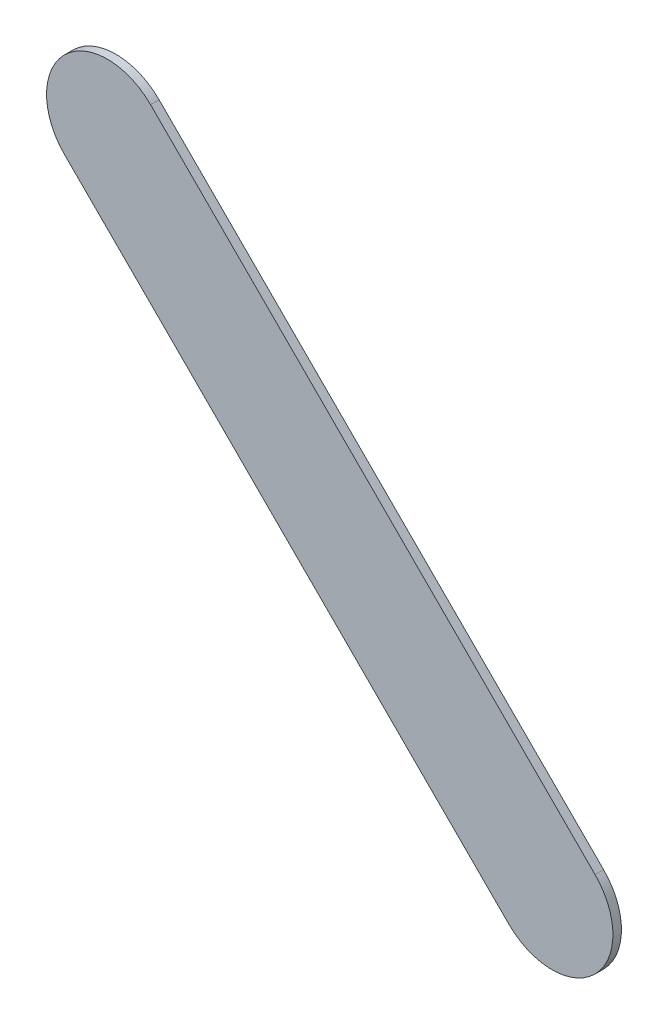
ISO-10303-21;
HEADER;
FILE_DESCRIPTION(('STEP AP214'),'2;1');
FILE_NAME('part.step','',(''),(''),'','','');
FILE_SCHEMA(('AUTOMOTIVE_DESIGN { 1 0 10303 214 1 1 1 1 }'));
ENDSEC;
DATA;
#1=APPLICATION_CONTEXT('core data for automotive mechanical design processes');
#2=APPLICATION_PROTOCOL_DEFINITION('international standard','automotive_design',2000,#1);
#3=PRODUCT_CONTEXT('',#1,'mechanical');
#4=PRODUCT('Part','Part','',(#3));
#5=PRODUCT_RELATED_PRODUCT_CATEGORY('part','',(#4));
#6=PRODUCT_DEFINITION_FORMATION('','',#4);
#7=PRODUCT_DEFINITION_CONTEXT('part definition',#1,'design');
#8=PRODUCT_DEFINITION('design','',#6,#7);
#9=PRODUCT_DEFINITION_SHAPE('','',#8);
#10=(LENGTH_UNIT() NAMED_UNIT(*) SI_UNIT(.MILLI.,.METRE.));
#11=(NAMED_UNIT(*) PLANE_ANGLE_UNIT() SI_UNIT($,.RADIAN.));
#12=(NAMED_UNIT(*) SI_UNIT($,.STERADIAN.) SOLID_ANGLE_UNIT());
#13=UNCERTAINTY_MEASURE_WITH_UNIT(LENGTH_MEASURE(1.E-05),#10,'distance_accuracy_value','');
#14=(GEOMETRIC_REPRESENTATION_CONTEXT(3) GLOBAL_UNCERTAINTY_ASSIGNED_CONTEXT((#13)) GLOBAL_UNIT_ASSIGNED_CONTEXT((#10,
#11,#12)) REPRESENTATION_CONTEXT('',''));
#15=CARTESIAN_POINT('',(0.,0.,0.));
#16=DIRECTION('',(0.,0.,1.));
#17=DIRECTION('',(1.,0.,0.));
#18=AXIS2_PLACEMENT_3D('',#15,#16,#17);
#19=CARTESIAN_POINT('',(82.123223,-120.976776,1.635));
#20=DIRECTION('',(0.,0.,1.));
#21=DIRECTION('',(1.,0.,0.));
#22=AXIS2_PLACEMENT_3D('',#19,#20,#21);
#23=PLANE('',#22);
#24=DIRECTION('',(0.707106781186548,-0.707106781186548,0.));
#25=VECTOR('',#24,1.);
#26=CARTESIAN_POINT('',(82.123223,-120.976776,1.635));
#27=LINE('',#26,#25);
#28=CARTESIAN_POINT('',(82.123223,-120.976776,1.635));
#29=VERTEX_POINT('',#28);
#30=CARTESIAN_POINT('',(83.948223,-122.801776,1.635));
#31=VERTEX_POINT('',#30);
#32=EDGE_CURVE('E91',#29,#31,#27,.T.);
#33=ORIENTED_EDGE('',*,*,#32,.T.);
#34=CARTESIAN_POINT('',(84.1249995,-122.6249995,1.635));
#35=DIRECTION('',(0.,0.,1.));
#36=DIRECTION('',(-0.707106781186548,-0.707106781186548,0.));
#37=AXIS2_PLACEMENT_3D('',#34,#35,#36);
#38=CIRCLE('',#37,0.249999723809);
#39=CARTESIAN_POINT('',(84.301776,-122.448223,1.635));
#40=VERTEX_POINT('',#39);
#41=EDGE_CURVE('E80',#31,#40,#38,.T.);
#42=ORIENTED_EDGE('',*,*,#41,.T.);
#43=DIRECTION('',(-0.707106781186548,0.707106781186548,0.));
#44=VECTOR('',#43,1.);
#45=CARTESIAN_POINT('',(84.301776,-122.448223,1.635));
#46=LINE('',#45,#44);
#47=CARTESIAN_POINT('',(82.476776,-120.623223,1.635));
#48=VERTEX_POINT('',#47);
#49=EDGE_CURVE('E20',#40,#48,#46,.T.);
#50=ORIENTED_EDGE('',*,*,#49,.T.);
#51=CARTESIAN_POINT('',(82.2999995,-120.7999995,1.635));
#52=DIRECTION('',(0.,0.,1.));
#53=DIRECTION('',(0.707106781186548,0.707106781186548,0.));
#54=AXIS2_PLACEMENT_3D('',#51,#52,#53);
#55=CIRCLE('',#54,0.249999723809);
#56=EDGE_CURVE('E11',#48,#29,#55,.T.);
#57=ORIENTED_EDGE('',*,*,#56,.T.);
#58=EDGE_LOOP('',(#33,#42,#50,#57));
#59=FACE_BOUND('',#58,.T.);
#60=ADVANCED_FACE('F17',(#59),#23,.T.);
#61=CARTESIAN_POINT('',(82.123223,-120.976776,1.6));
#62=DIRECTION('',(0.,0.,1.));
#63=DIRECTION('',(1.,0.,0.));
#64=AXIS2_PLACEMENT_3D('',#61,#62,#63);
#65=PLANE('',#64);
#66=CARTESIAN_POINT('',(82.2999995,-120.7999995,1.6));
#67=DIRECTION('',(0.,0.,1.));
#68=DIRECTION('',(0.707106781186548,0.707106781186548,0.));
#69=AXIS2_PLACEMENT_3D('',#66,#67,#68);
#70=CIRCLE('',#69,0.249999723809);
#71=CARTESIAN_POINT('',(82.476776,-120.623223,1.6));
#72=VERTEX_POINT('',#71);
#73=CARTESIAN_POINT('',(82.123223,-120.976776,1.6));
#74=VERTEX_POINT('',#73);
#75=EDGE_CURVE('E27',#72,#74,#70,.T.);
#76=ORIENTED_EDGE('',*,*,#75,.F.);
#77=DIRECTION('',(-0.707106781186548,0.707106781186548,0.));
#78=VECTOR('',#77,1.);
#79=CARTESIAN_POINT('',(84.301776,-122.448223,1.6));
#80=LINE('',#79,#78);
#81=CARTESIAN_POINT('',(84.301776,-122.448223,1.6));
#82=VERTEX_POINT('',#81);
#83=EDGE_CURVE('E55',#82,#72,#80,.T.);
#84=ORIENTED_EDGE('',*,*,#83,.F.);
#85=CARTESIAN_POINT('',(84.1249995,-122.6249995,1.6));
#86=DIRECTION('',(0.,0.,1.));
#87=DIRECTION('',(-0.707106781186548,-0.707106781186548,0.));
#88=AXIS2_PLACEMENT_3D('',#85,#86,#87);
#89=CIRCLE('',#88,0.249999723809);
#90=CARTESIAN_POINT('',(83.948223,-122.801776,1.6));
#91=VERTEX_POINT('',#90);
#92=EDGE_CURVE('E74',#91,#82,#89,.T.);
#93=ORIENTED_EDGE('',*,*,#92,.F.);
#94=DIRECTION('',(0.707106781186548,-0.707106781186548,0.));
#95=VECTOR('',#94,1.);
#96=CARTESIAN_POINT('',(82.123223,-120.976776,1.6));
#97=LINE('',#96,#95);
#98=EDGE_CURVE('E98',#74,#91,#97,.T.);
#99=ORIENTED_EDGE('',*,*,#98,.F.);
#100=EDGE_LOOP('',(#76,#84,#93,#99));
#101=FACE_BOUND('',#100,.T.);
#102=ADVANCED_FACE('F122',(#101),#65,.F.);
#103=CARTESIAN_POINT('',(82.2999995,-120.7999995,1.6));
#104=DIRECTION('',(0.,0.,-1.));
#105=DIRECTION('',(0.707106781186548,0.707106781186548,0.));
#106=AXIS2_PLACEMENT_3D('',#103,#104,#105);
#107=CYLINDRICAL_SURFACE('',#106,0.249999723809);
#108=ORIENTED_EDGE('',*,*,#75,.T.);
#109=DIRECTION('',(0.,0.,1.));
#110=VECTOR('',#109,1.);
#111=CARTESIAN_POINT('',(82.123223,-120.976776,1.6));
#112=LINE('',#111,#110);
#113=EDGE_CURVE('E95',#74,#29,#112,.T.);
#114=ORIENTED_EDGE('',*,*,#113,.T.);
#115=ORIENTED_EDGE('',*,*,#56,.F.);
#116=DIRECTION('',(0.,0.,1.));
#117=VECTOR('',#116,1.);
#118=CARTESIAN_POINT('',(82.476776,-120.623223,1.6));
#119=LINE('',#118,#117);
#120=EDGE_CURVE('E112',#72,#48,#119,.T.);
#121=ORIENTED_EDGE('',*,*,#120,.F.);
#122=EDGE_LOOP('',(#108,#114,#115,#121));
#123=FACE_BOUND('',#122,.T.);
#124=ADVANCED_FACE('F120',(#123),#107,.T.);
#125=CARTESIAN_POINT('',(84.301776,-122.448223,1.6));
#126=DIRECTION('',(-0.707106781186548,-0.707106781186548,0.));
#127=DIRECTION('',(-0.707106781186548,0.707106781186548,0.));
#128=AXIS2_PLACEMENT_3D('',#125,#126,#127);
#129=PLANE('',#128);
#130=ORIENTED_EDGE('',*,*,#83,.T.);
#131=ORIENTED_EDGE('',*,*,#120,.T.);
#132=ORIENTED_EDGE('',*,*,#49,.F.);
#133=DIRECTION('',(0.,0.,1.));
#134=VECTOR('',#133,1.);
#135=CARTESIAN_POINT('',(84.301776,-122.448223,1.6));
#136=LINE('',#135,#134);
#137=EDGE_CURVE('E86',#82,#40,#136,.T.);
#138=ORIENTED_EDGE('',*,*,#137,.F.);
#139=EDGE_LOOP('',(#130,#131,#132,#138));
#140=FACE_BOUND('',#139,.T.);
#141=ADVANCED_FACE('F119',(#140),#129,.F.);
#142=CARTESIAN_POINT('',(84.1249995,-122.6249995,1.6));
#143=DIRECTION('',(0.,0.,-1.));
#144=DIRECTION('',(-0.707106781186548,-0.707106781186548,0.));
#145=AXIS2_PLACEMENT_3D('',#142,#143,#144);
#146=CYLINDRICAL_SURFACE('',#145,0.249999723809);
#147=ORIENTED_EDGE('',*,*,#92,.T.);
#148=ORIENTED_EDGE('',*,*,#137,.T.);
#149=ORIENTED_EDGE('',*,*,#41,.F.);
#150=DIRECTION('',(0.,0.,1.));
#151=VECTOR('',#150,1.);
#152=CARTESIAN_POINT('',(83.948223,-122.801776,1.6));
#153=LINE('',#152,#151);
#154=EDGE_CURVE('E84',#91,#31,#153,.T.);
#155=ORIENTED_EDGE('',*,*,#154,.F.);
#156=EDGE_LOOP('',(#147,#148,#149,#155));
#157=FACE_BOUND('',#156,.T.);
#158=ADVANCED_FACE('F82',(#157),#146,.T.);
#159=CARTESIAN_POINT('',(82.123223,-120.976776,1.6));
#160=DIRECTION('',(0.707106781186548,0.707106781186548,0.));
#161=DIRECTION('',(0.,0.,-1.));
#162=AXIS2_PLACEMENT_3D('',#159,#160,#161);
#163=PLANE('',#162);
#164=ORIENTED_EDGE('',*,*,#98,.T.);
#165=ORIENTED_EDGE('',*,*,#154,.T.);
#166=ORIENTED_EDGE('',*,*,#32,.F.);
#167=ORIENTED_EDGE('',*,*,#113,.F.);
#168=EDGE_LOOP('',(#164,#165,#166,#167));
#169=FACE_BOUND('',#168,.T.);
#170=ADVANCED_FACE('F97',(#169),#163,.F.);
#171=CLOSED_SHELL('',(#60,#102,#124,#141,#158,#170));
#172=MANIFOLD_SOLID_BREP('B1',#171);
#173=ADVANCED_BREP_SHAPE_REPRESENTATION('',(#18,#172),#14);
#174=SHAPE_DEFINITION_REPRESENTATION(#9,#173);
ENDSEC;
END-ISO-10303-21;
